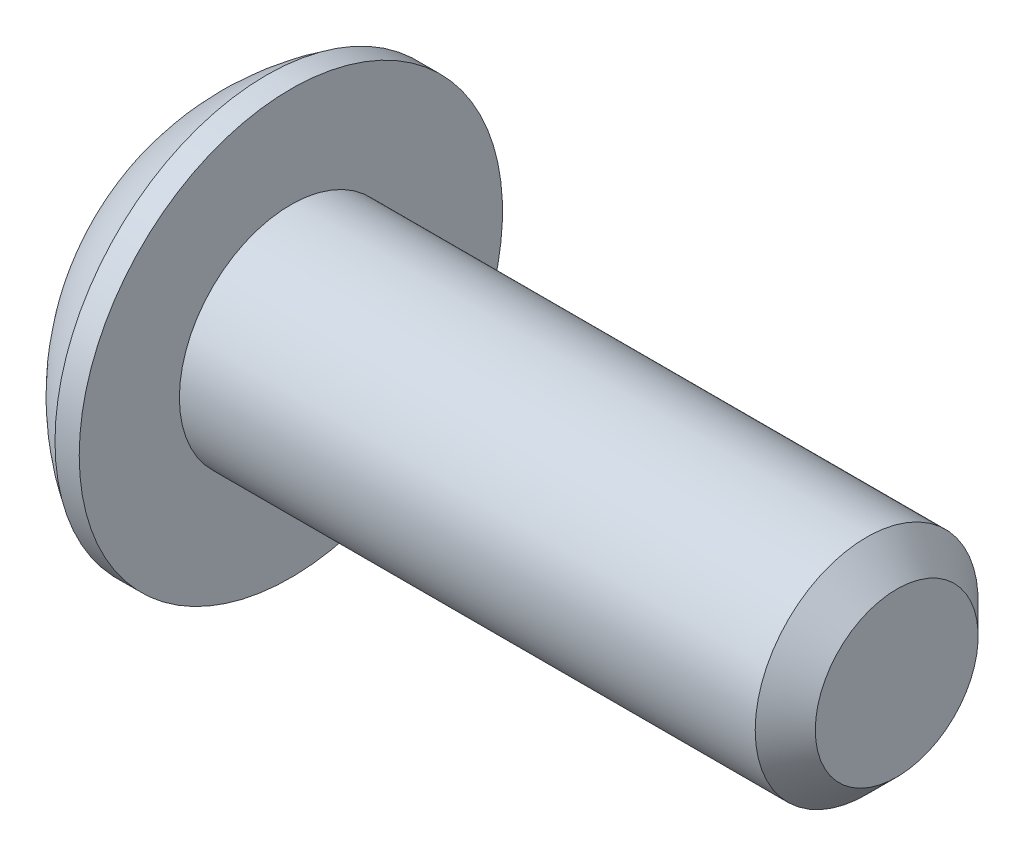
ISO-10303-21;
HEADER;
FILE_DESCRIPTION(('STEP AP214'),'2;1');
FILE_NAME('part.step','',(''),(''),'','','');
FILE_SCHEMA(('AUTOMOTIVE_DESIGN { 1 0 10303 214 1 1 1 1 }'));
ENDSEC;
DATA;
#1=APPLICATION_CONTEXT('core data for automotive mechanical design processes');
#2=APPLICATION_PROTOCOL_DEFINITION('international standard','automotive_design',2000,#1);
#3=PRODUCT_CONTEXT('',#1,'mechanical');
#4=PRODUCT('Part','Part','',(#3));
#5=PRODUCT_RELATED_PRODUCT_CATEGORY('part','',(#4));
#6=PRODUCT_DEFINITION_FORMATION('','',#4);
#7=PRODUCT_DEFINITION_CONTEXT('part definition',#1,'design');
#8=PRODUCT_DEFINITION('design','',#6,#7);
#9=PRODUCT_DEFINITION_SHAPE('','',#8);
#10=(LENGTH_UNIT() NAMED_UNIT(*) SI_UNIT(.MILLI.,.METRE.));
#11=(NAMED_UNIT(*) PLANE_ANGLE_UNIT() SI_UNIT($,.RADIAN.));
#12=(NAMED_UNIT(*) SI_UNIT($,.STERADIAN.) SOLID_ANGLE_UNIT());
#13=UNCERTAINTY_MEASURE_WITH_UNIT(LENGTH_MEASURE(1.E-05),#10,'distance_accuracy_value','');
#14=(GEOMETRIC_REPRESENTATION_CONTEXT(3) GLOBAL_UNCERTAINTY_ASSIGNED_CONTEXT((#13)) GLOBAL_UNIT_ASSIGNED_CONTEXT((#10,
#11,#12)) REPRESENTATION_CONTEXT('',''));
#15=CARTESIAN_POINT('',(0.,0.,0.));
#16=DIRECTION('',(0.,0.,1.));
#17=DIRECTION('',(1.,0.,0.));
#18=AXIS2_PLACEMENT_3D('',#15,#16,#17);
#19=CARTESIAN_POINT('',(0.,0.,0.));
#20=DIRECTION('',(-1.,0.,0.));
#21=DIRECTION('',(0.,0.,1.));
#22=AXIS2_PLACEMENT_3D('',#19,#20,#21);
#23=PLANE('',#22);
#24=CARTESIAN_POINT('',(0.,0.,0.));
#25=DIRECTION('',(-1.,0.,0.));
#26=DIRECTION('',(0.,0.,1.));
#27=AXIS2_PLACEMENT_3D('',#24,#25,#26);
#28=CIRCLE('',#27,1.6637);
#29=CARTESIAN_POINT('',(0.,1.6637,0.));
#30=VERTEX_POINT('',#29);
#31=EDGE_CURVE('E11',#30,#30,#28,.T.);
#32=ORIENTED_EDGE('',*,*,#31,.T.);
#33=EDGE_LOOP('',(#32));
#34=FACE_BOUND('',#33,.T.);
#35=DIRECTION('',(0.,-1.,0.));
#36=VECTOR('',#35,1.);
#37=CARTESIAN_POINT('',(0.,-0.571923176659242,0.9906));
#38=LINE('',#37,#36);
#39=CARTESIAN_POINT('',(0.,0.571923176659245,0.9906));
#40=VERTEX_POINT('',#39);
#41=CARTESIAN_POINT('',(0.,-0.571923176659242,0.9906));
#42=VERTEX_POINT('',#41);
#43=EDGE_CURVE('E47',#40,#42,#38,.T.);
#44=ORIENTED_EDGE('',*,*,#43,.T.);
#45=DIRECTION('',(0.,-0.5,-0.866025403784439));
#46=VECTOR('',#45,1.);
#47=CARTESIAN_POINT('',(0.,-1.14384635331848,0.));
#48=LINE('',#47,#46);
#49=CARTESIAN_POINT('',(0.,-1.14384635331848,0.));
#50=VERTEX_POINT('',#49);
#51=EDGE_CURVE('E368',#42,#50,#48,.T.);
#52=ORIENTED_EDGE('',*,*,#51,.T.);
#53=DIRECTION('',(0.,0.5,-0.866025403784439));
#54=VECTOR('',#53,1.);
#55=CARTESIAN_POINT('',(0.,-0.571923176659242,-0.9906));
#56=LINE('',#55,#54);
#57=CARTESIAN_POINT('',(0.,-0.571923176659242,-0.9906));
#58=VERTEX_POINT('',#57);
#59=EDGE_CURVE('E132',#50,#58,#56,.T.);
#60=ORIENTED_EDGE('',*,*,#59,.T.);
#61=DIRECTION('',(0.,1.,0.));
#62=VECTOR('',#61,1.);
#63=CARTESIAN_POINT('',(0.,0.571923176659245,-0.9906));
#64=LINE('',#63,#62);
#65=CARTESIAN_POINT('',(0.,0.571923176659245,-0.9906));
#66=VERTEX_POINT('',#65);
#67=EDGE_CURVE('E371',#58,#66,#64,.T.);
#68=ORIENTED_EDGE('',*,*,#67,.T.);
#69=DIRECTION('',(0.,0.5,0.866025403784439));
#70=VECTOR('',#69,1.);
#71=CARTESIAN_POINT('',(0.,1.14384635331849,0.));
#72=LINE('',#71,#70);
#73=CARTESIAN_POINT('',(0.,1.14384635331849,0.));
#74=VERTEX_POINT('',#73);
#75=EDGE_CURVE('E373',#66,#74,#72,.T.);
#76=ORIENTED_EDGE('',*,*,#75,.T.);
#77=DIRECTION('',(0.,-0.5,0.866025403784439));
#78=VECTOR('',#77,1.);
#79=CARTESIAN_POINT('',(0.,0.571923176659245,0.9906));
#80=LINE('',#79,#78);
#81=EDGE_CURVE('E375',#74,#40,#80,.T.);
#82=ORIENTED_EDGE('',*,*,#81,.T.);
#83=EDGE_LOOP('',(#44,#52,#60,#68,#76,#82));
#84=FACE_BOUND('',#83,.T.);
#85=ADVANCED_FACE('F33',(#34,#84),#23,.T.);
#86=CARTESIAN_POINT('',(3.55485043103448,0.,0.));
#87=DIRECTION('',(-1.,0.,0.));
#88=DIRECTION('',(0.,1.,0.));
#89=AXIS2_PLACEMENT_3D('',#86,#87,#88);
#90=SPHERICAL_SURFACE('',#89,3.92490245445999);
#91=CARTESIAN_POINT('',(1.4732,0.,0.));
#92=DIRECTION('',(-1.,0.,0.));
#93=DIRECTION('',(0.,0.,1.));
#94=AXIS2_PLACEMENT_3D('',#91,#92,#93);
#95=CIRCLE('',#94,3.3274);
#96=CARTESIAN_POINT('',(1.4732,3.3274,0.));
#97=VERTEX_POINT('',#96);
#98=EDGE_CURVE('E40',#97,#97,#95,.T.);
#99=CARTESIAN_POINT('',(1.4732,3.3274,0.));
#100=CARTESIAN_POINT('',(1.45330383338302,3.31495281350127,0.));
#101=CARTESIAN_POINT('',(1.43351933465701,3.30232713364523,0.));
#102=CARTESIAN_POINT('',(1.39417998096444,3.27672293945236,0.));
#103=CARTESIAN_POINT('',(1.37462512599787,3.26374442511553,0.));
#104=CARTESIAN_POINT('',(1.33575136780167,3.23743871419496,0.));
#105=CARTESIAN_POINT('',(1.31643246457203,3.22411151761122,0.));
#106=CARTESIAN_POINT('',(1.27803682210257,3.19711273705128,0.));
#107=CARTESIAN_POINT('',(1.25896008286274,3.18344115307508,0.));
#108=CARTESIAN_POINT('',(1.22105490800766,3.15575799525025,0.));
#109=CARTESIAN_POINT('',(1.20222647239241,3.14174642140161,0.));
#110=CARTESIAN_POINT('',(1.1648239631005,3.11338779293801,0.));
#111=CARTESIAN_POINT('',(1.14624988942385,3.09904073832305,0.));
#112=CARTESIAN_POINT('',(1.1093620808555,3.07001576479871,0.));
#113=CARTESIAN_POINT('',(1.09104834596381,3.05533784588932,0.));
#114=CARTESIAN_POINT('',(1.05468710793785,3.02565586687034,0.));
#115=CARTESIAN_POINT('',(1.03663960480358,3.01065180676075,0.));
#116=CARTESIAN_POINT('',(1.00081663762422,2.98032237333929,0.));
#117=CARTESIAN_POINT('',(0.983041173579128,2.96499700002743,0.));
#118=CARTESIAN_POINT('',(0.947768004365813,2.93402987160278,0.));
#119=CARTESIAN_POINT('',(0.930270299197587,2.91838811648999,0.));
#120=CARTESIAN_POINT('',(0.895558278150386,2.8867932576672,0.));
#121=CARTESIAN_POINT('',(0.878343962271412,2.87084015395718,0.));
#122=CARTESIAN_POINT('',(0.844204259025566,2.83862773133017,0.));
#123=CARTESIAN_POINT('',(0.827278871658694,2.82236841241317,0.));
#124=CARTESIAN_POINT('',(0.79372247168862,2.78954879129617,0.));
#125=CARTESIAN_POINT('',(0.777091459085418,2.77298848909617,0.));
#126=CARTESIAN_POINT('',(0.744129160170297,2.73957223018758,0.));
#127=CARTESIAN_POINT('',(0.727797873858377,2.722716273479,0.));
#128=CARTESIAN_POINT('',(0.695440282607511,2.68871412946341,0.));
#129=CARTESIAN_POINT('',(0.679413977668563,2.6715679421564,0.));
#130=CARTESIAN_POINT('',(0.647671506108413,2.63699085424448,0.));
#131=CARTESIAN_POINT('',(0.63195533948721,2.61955995363958,0.));
#132=CARTESIAN_POINT('',(0.600838201711008,2.58441904804749,0.));
#133=CARTESIAN_POINT('',(0.58543723055601,2.5667090430603,0.));
#134=CARTESIAN_POINT('',(0.554955439437071,2.53101562742945,0.));
#135=CARTESIAN_POINT('',(0.53987461947313,2.51303221678579,0.));
#136=CARTESIAN_POINT('',(0.510037983442905,2.47679777654429,0.));
#137=CARTESIAN_POINT('',(0.495282167376621,2.45854674694645,0.));
#138=CARTESIAN_POINT('',(0.466100287268539,2.42178294161331,0.));
#139=CARTESIAN_POINT('',(0.451674223226741,2.40327016587801,0.));
#140=CARTESIAN_POINT('',(0.423156489186868,2.36598882531137,0.));
#141=CARTESIAN_POINT('',(0.409064819188792,2.34722026048002,0.));
#142=CARTESIAN_POINT('',(0.381220407654211,2.30943338107051,0.));
#143=CARTESIAN_POINT('',(0.367467666117706,2.29041506649236,0.));
#144=CARTESIAN_POINT('',(0.340305536863938,2.25213480730286,0.));
#145=CARTESIAN_POINT('',(0.326896149146676,2.23287286269151,0.));
#146=CARTESIAN_POINT('',(0.300425042403801,2.19411154154494,0.));
#147=CARTESIAN_POINT('',(0.287363323378188,2.17461216500972,0.));
#148=CARTESIAN_POINT('',(0.261591757021412,2.135382254524,0.));
#149=CARTESIAN_POINT('',(0.248881909690248,2.11565172057349,0.));
#150=CARTESIAN_POINT('',(0.223818176487825,2.07596584415351,0.));
#151=CARTESIAN_POINT('',(0.211464290616564,2.05601050168404,0.));
#152=CARTESIAN_POINT('',(0.187116455603135,2.01588142943932,0.));
#153=CARTESIAN_POINT('',(0.175122506460965,1.99570769966405,0.));
#154=CARTESIAN_POINT('',(0.15149840418644,1.9551483443759,0.));
#155=CARTESIAN_POINT('',(0.139868251054083,1.93476271886302,0.));
#156=CARTESIAN_POINT('',(0.116975483644661,1.89378613154432,0.));
#157=CARTESIAN_POINT('',(0.105712869367595,1.87319516973851,0.));
#158=CARTESIAN_POINT('',(0.0835588019074144,1.83181453649859,0.));
#159=CARTESIAN_POINT('',(0.0726673487243005,1.81102486506448,0.));
#160=CARTESIAN_POINT('',(0.0512591149920269,1.76925349889341,0.));
#161=CARTESIAN_POINT('',(0.0407423344428671,1.74827180415644,0.));
#162=CARTESIAN_POINT('',(0.0200868043622349,1.7061231554675,0.));
#163=CARTESIAN_POINT('',(0.00994805483076251,1.68495620151554,0.));
#164=CARTESIAN_POINT('',(0.,1.6637,0.));
#165=B_SPLINE_CURVE_WITH_KNOTS('',3,(#99,#100,#101,#102,#103,#104,#105,#106,#107,#108,#109,#110,
#111,#112,#113,#114,#115,#116,#117,#118,#119,#120,#121,#122,#123,#124,#125,#126,#127,#128,#129,
#130,#131,#132,#133,#134,#135,#136,#137,#138,#139,#140,#141,#142,#143,#144,#145,#146,#147,#148,
#149,#150,#151,#152,#153,#154,#155,#156,#157,#158,#159,#160,#161,#162,#163,#164),.UNSPECIFIED.,
.F.,.F.,(4,2,2,2,2,2,2,2,2,2,2,2,2,2,2,2,2,2,2,2,2,2,2,2,2,2,2,2,2,2,2,2,4),(0.,
0.0704057950343177,0.140811590068636,0.211217385102953,0.281623180137271,0.352028975171589,
0.422434770205906,0.492840565240224,0.563246360274542,0.63365215530886,0.704057950343178,
0.774463745377495,0.844869540411813,0.915275335446131,0.985681130480448,1.05608692551477,
1.12649272054908,1.1968985155834,1.26730431061772,1.33771010565204,1.40811590068636,
1.47852169572067,1.54892749075499,1.61933328578931,1.68973908082363,1.76014487585794,
1.83055067089226,1.90095646592658,1.9713622609609,2.04176805599521,2.11217385102953,
2.18257964606385,2.25298544109817),.UNSPECIFIED.);
#166=EDGE_CURVE('BSEAM159',#97,#30,#165,.T.);
#167=ORIENTED_EDGE('',*,*,#98,.T.);
#168=ORIENTED_EDGE('',*,*,#31,.F.);
#169=ORIENTED_EDGE('',*,*,#166,.T.);
#170=ORIENTED_EDGE('',*,*,#166,.F.);
#171=EDGE_LOOP('',(#167,#169,#168,#170));
#172=FACE_BOUND('',#171,.T.);
#173=ADVANCED_FACE('F159',(#172),#90,.T.);
#174=CARTESIAN_POINT('',(0.,0.,0.));
#175=DIRECTION('',(-1.,0.,0.));
#176=DIRECTION('',(0.,0.,1.));
#177=AXIS2_PLACEMENT_3D('',#174,#175,#176);
#178=CYLINDRICAL_SURFACE('',#177,3.3274);
#179=ORIENTED_EDGE('',*,*,#98,.F.);
#180=EDGE_LOOP('',(#179));
#181=FACE_BOUND('',#180,.T.);
#182=CARTESIAN_POINT('',(1.8542,0.,0.));
#183=DIRECTION('',(-1.,0.,0.));
#184=DIRECTION('',(0.,0.,1.));
#185=AXIS2_PLACEMENT_3D('',#182,#183,#184);
#186=CIRCLE('',#185,3.3274);
#187=CARTESIAN_POINT('',(1.8542,0.,3.3274));
#188=VERTEX_POINT('',#187);
#189=EDGE_CURVE('E154',#188,#188,#186,.T.);
#190=ORIENTED_EDGE('',*,*,#189,.T.);
#191=EDGE_LOOP('',(#190));
#192=FACE_BOUND('',#191,.T.);
#193=ADVANCED_FACE('F162',(#181,#192),#178,.T.);
#194=CARTESIAN_POINT('',(1.8542,1.7526,0.));
#195=DIRECTION('',(-1.,0.,0.));
#196=DIRECTION('',(0.,0.,1.));
#197=AXIS2_PLACEMENT_3D('',#194,#195,#196);
#198=PLANE('',#197);
#199=ORIENTED_EDGE('',*,*,#189,.F.);
#200=EDGE_LOOP('',(#199));
#201=FACE_BOUND('',#200,.T.);
#202=CARTESIAN_POINT('',(1.8542,0.,0.));
#203=DIRECTION('',(-1.,0.,0.));
#204=DIRECTION('',(0.,0.,1.));
#205=AXIS2_PLACEMENT_3D('',#202,#203,#204);
#206=CIRCLE('',#205,1.7526);
#207=CARTESIAN_POINT('',(1.8542,0.,1.7526));
#208=VERTEX_POINT('',#207);
#209=EDGE_CURVE('E151',#208,#208,#206,.T.);
#210=ORIENTED_EDGE('',*,*,#209,.T.);
#211=EDGE_LOOP('',(#210));
#212=FACE_BOUND('',#211,.T.);
#213=ADVANCED_FACE('F165',(#201,#212),#198,.F.);
#214=CARTESIAN_POINT('',(0.,0.,0.));
#215=DIRECTION('',(-1.,0.,0.));
#216=DIRECTION('',(0.,0.,1.));
#217=AXIS2_PLACEMENT_3D('',#214,#215,#216);
#218=CYLINDRICAL_SURFACE('',#217,1.7526);
#219=ORIENTED_EDGE('',*,*,#209,.F.);
#220=EDGE_LOOP('',(#219));
#221=FACE_BOUND('',#220,.T.);
#222=CARTESIAN_POINT('',(10.90676,0.,0.));
#223=DIRECTION('',(-1.,0.,0.));
#224=DIRECTION('',(0.,0.,1.));
#225=AXIS2_PLACEMENT_3D('',#222,#223,#224);
#226=CIRCLE('',#225,1.7526);
#227=CARTESIAN_POINT('',(10.90676,0.,1.7526));
#228=VERTEX_POINT('',#227);
#229=EDGE_CURVE('E148',#228,#228,#226,.T.);
#230=ORIENTED_EDGE('',*,*,#229,.T.);
#231=EDGE_LOOP('',(#230));
#232=FACE_BOUND('',#231,.T.);
#233=ADVANCED_FACE('F171',(#221,#232),#218,.T.);
#234=CARTESIAN_POINT('',(11.3792,0.,0.));
#235=DIRECTION('',(-1.,0.,0.));
#236=DIRECTION('',(0.,0.,1.));
#237=AXIS2_PLACEMENT_3D('',#234,#235,#236);
#238=CONICAL_SURFACE('',#237,1.28016,0.785398163397446);
#239=ORIENTED_EDGE('',*,*,#229,.F.);
#240=EDGE_LOOP('',(#239));
#241=FACE_BOUND('',#240,.T.);
#242=CARTESIAN_POINT('',(11.3792,0.,0.));
#243=DIRECTION('',(-1.,0.,0.));
#244=DIRECTION('',(0.,0.,1.));
#245=AXIS2_PLACEMENT_3D('',#242,#243,#244);
#246=CIRCLE('',#245,1.28016);
#247=CARTESIAN_POINT('',(11.3792,0.,1.28016));
#248=VERTEX_POINT('',#247);
#249=EDGE_CURVE('E144',#248,#248,#246,.T.);
#250=ORIENTED_EDGE('',*,*,#249,.T.);
#251=EDGE_LOOP('',(#250));
#252=FACE_BOUND('',#251,.T.);
#253=ADVANCED_FACE('F177',(#241,#252),#238,.T.);
#254=CARTESIAN_POINT('',(11.3792,0.,0.));
#255=DIRECTION('',(-1.,0.,0.));
#256=DIRECTION('',(0.,0.,1.));
#257=AXIS2_PLACEMENT_3D('',#254,#255,#256);
#258=PLANE('',#257);
#259=ORIENTED_EDGE('',*,*,#249,.F.);
#260=EDGE_LOOP('',(#259));
#261=FACE_BOUND('',#260,.T.);
#262=ADVANCED_FACE('F183',(#261),#258,.F.);
#263=CARTESIAN_POINT('',(1.1176,-1.14384635331848,0.));
#264=DIRECTION('',(0.,0.866025403784439,-0.5));
#265=DIRECTION('',(0.,0.5,0.866025403784439));
#266=AXIS2_PLACEMENT_3D('',#263,#264,#265);
#267=PLANE('',#266);
#268=DIRECTION('',(0.,-0.5,-0.866025403784439));
#269=VECTOR('',#268,1.);
#270=CARTESIAN_POINT('',(1.1176,-1.14384635331848,0.));
#271=LINE('',#270,#269);
#272=CARTESIAN_POINT('',(1.1176,-0.571923176659242,0.9906));
#273=VERTEX_POINT('',#272);
#274=CARTESIAN_POINT('',(1.1176,-0.857884764988864,0.495299999999999));
#275=VERTEX_POINT('',#274);
#276=EDGE_CURVE('E115',#273,#275,#271,.T.);
#277=ORIENTED_EDGE('',*,*,#276,.T.);
#278=CARTESIAN_POINT('',(1.1176,-1.14384635331848,0.));
#279=VERTEX_POINT('',#278);
#280=EDGE_CURVE('E108',#275,#279,#271,.T.);
#281=ORIENTED_EDGE('',*,*,#280,.T.);
#282=DIRECTION('',(-1.,0.,0.));
#283=VECTOR('',#282,1.);
#284=CARTESIAN_POINT('',(1.1176,-1.14384635331848,0.));
#285=LINE('',#284,#283);
#286=EDGE_CURVE('E112',#279,#50,#285,.T.);
#287=ORIENTED_EDGE('',*,*,#286,.T.);
#288=ORIENTED_EDGE('',*,*,#51,.F.);
#289=DIRECTION('',(-1.,0.,0.));
#290=VECTOR('',#289,1.);
#291=CARTESIAN_POINT('',(1.1176,-0.571923176659242,0.9906));
#292=LINE('',#291,#290);
#293=EDGE_CURVE('E367',#273,#42,#292,.T.);
#294=ORIENTED_EDGE('',*,*,#293,.F.);
#295=EDGE_LOOP('',(#277,#281,#287,#288,#294));
#296=FACE_BOUND('',#295,.T.);
#297=ADVANCED_FACE('F110',(#296),#267,.T.);
#298=CARTESIAN_POINT('',(1.1176,-0.571923176659242,-0.9906));
#299=DIRECTION('',(0.,0.866025403784439,0.5));
#300=DIRECTION('',(0.,-0.5,0.866025403784439));
#301=AXIS2_PLACEMENT_3D('',#298,#299,#300);
#302=PLANE('',#301);
#303=DIRECTION('',(0.,0.5,-0.866025403784439));
#304=VECTOR('',#303,1.);
#305=CARTESIAN_POINT('',(1.1176,-0.571923176659242,-0.9906));
#306=LINE('',#305,#304);
#307=CARTESIAN_POINT('',(1.1176,-0.857884764988864,-0.495299999999999));
#308=VERTEX_POINT('',#307);
#309=EDGE_CURVE('E120',#279,#308,#306,.T.);
#310=ORIENTED_EDGE('',*,*,#309,.T.);
#311=CARTESIAN_POINT('',(1.1176,-0.571923176659242,-0.9906));
#312=VERTEX_POINT('',#311);
#313=EDGE_CURVE('E127',#308,#312,#306,.T.);
#314=ORIENTED_EDGE('',*,*,#313,.T.);
#315=DIRECTION('',(-1.,0.,0.));
#316=VECTOR('',#315,1.);
#317=CARTESIAN_POINT('',(1.1176,-0.571923176659242,-0.9906));
#318=LINE('',#317,#316);
#319=EDGE_CURVE('E134',#312,#58,#318,.T.);
#320=ORIENTED_EDGE('',*,*,#319,.T.);
#321=ORIENTED_EDGE('',*,*,#59,.F.);
#322=ORIENTED_EDGE('',*,*,#286,.F.);
#323=EDGE_LOOP('',(#310,#314,#320,#321,#322));
#324=FACE_BOUND('',#323,.T.);
#325=ADVANCED_FACE('F130',(#324),#302,.T.);
#326=CARTESIAN_POINT('',(1.1176,0.571923176659245,-0.9906));
#327=DIRECTION('',(0.,0.,1.));
#328=DIRECTION('',(1.,0.,0.));
#329=AXIS2_PLACEMENT_3D('',#326,#327,#328);
#330=PLANE('',#329);
#331=DIRECTION('',(0.,1.,0.));
#332=VECTOR('',#331,1.);
#333=CARTESIAN_POINT('',(1.1176,0.571923176659245,-0.9906));
#334=LINE('',#333,#332);
#335=CARTESIAN_POINT('',(1.1176,0.,-0.9906));
#336=VERTEX_POINT('',#335);
#337=EDGE_CURVE('E392',#312,#336,#334,.T.);
#338=ORIENTED_EDGE('',*,*,#337,.T.);
#339=CARTESIAN_POINT('',(1.1176,0.571923176659245,-0.9906));
#340=VERTEX_POINT('',#339);
#341=EDGE_CURVE('E126',#336,#340,#334,.T.);
#342=ORIENTED_EDGE('',*,*,#341,.T.);
#343=DIRECTION('',(-1.,0.,0.));
#344=VECTOR('',#343,1.);
#345=CARTESIAN_POINT('',(1.1176,0.571923176659245,-0.9906));
#346=LINE('',#345,#344);
#347=EDGE_CURVE('E139',#340,#66,#346,.T.);
#348=ORIENTED_EDGE('',*,*,#347,.T.);
#349=ORIENTED_EDGE('',*,*,#67,.F.);
#350=ORIENTED_EDGE('',*,*,#319,.F.);
#351=EDGE_LOOP('',(#338,#342,#348,#349,#350));
#352=FACE_BOUND('',#351,.T.);
#353=ADVANCED_FACE('F242',(#352),#330,.T.);
#354=CARTESIAN_POINT('',(1.1176,1.14384635331849,0.));
#355=DIRECTION('',(0.,-0.866025403784439,0.5));
#356=DIRECTION('',(0.,-0.5,-0.866025403784439));
#357=AXIS2_PLACEMENT_3D('',#354,#355,#356);
#358=PLANE('',#357);
#359=DIRECTION('',(0.,0.5,0.866025403784439));
#360=VECTOR('',#359,1.);
#361=CARTESIAN_POINT('',(1.1176,1.14384635331849,0.));
#362=LINE('',#361,#360);
#363=CARTESIAN_POINT('',(1.1176,0.857884764988866,-0.495300000000001));
#364=VERTEX_POINT('',#363);
#365=EDGE_CURVE('E354',#340,#364,#362,.T.);
#366=ORIENTED_EDGE('',*,*,#365,.T.);
#367=CARTESIAN_POINT('',(1.1176,1.14384635331849,0.));
#368=VERTEX_POINT('',#367);
#369=EDGE_CURVE('E394',#364,#368,#362,.T.);
#370=ORIENTED_EDGE('',*,*,#369,.T.);
#371=DIRECTION('',(-1.,0.,0.));
#372=VECTOR('',#371,1.);
#373=CARTESIAN_POINT('',(1.1176,1.14384635331849,0.));
#374=LINE('',#373,#372);
#375=EDGE_CURVE('E360',#368,#74,#374,.T.);
#376=ORIENTED_EDGE('',*,*,#375,.T.);
#377=ORIENTED_EDGE('',*,*,#75,.F.);
#378=ORIENTED_EDGE('',*,*,#347,.F.);
#379=EDGE_LOOP('',(#366,#370,#376,#377,#378));
#380=FACE_BOUND('',#379,.T.);
#381=ADVANCED_FACE('F251',(#380),#358,.T.);
#382=CARTESIAN_POINT('',(1.1176,0.571923176659245,0.9906));
#383=DIRECTION('',(0.,-0.866025403784439,-0.5));
#384=DIRECTION('',(0.,0.5,-0.866025403784439));
#385=AXIS2_PLACEMENT_3D('',#382,#383,#384);
#386=PLANE('',#385);
#387=DIRECTION('',(0.,-0.5,0.866025403784439));
#388=VECTOR('',#387,1.);
#389=CARTESIAN_POINT('',(1.1176,0.571923176659245,0.9906));
#390=LINE('',#389,#388);
#391=CARTESIAN_POINT('',(1.1176,0.857884764988866,0.495300000000001));
#392=VERTEX_POINT('',#391);
#393=EDGE_CURVE('E353',#368,#392,#390,.T.);
#394=ORIENTED_EDGE('',*,*,#393,.T.);
#395=CARTESIAN_POINT('',(1.1176,0.571923176659245,0.9906));
#396=VERTEX_POINT('',#395);
#397=EDGE_CURVE('E350',#392,#396,#390,.T.);
#398=ORIENTED_EDGE('',*,*,#397,.T.);
#399=DIRECTION('',(-1.,0.,0.));
#400=VECTOR('',#399,1.);
#401=CARTESIAN_POINT('',(1.1176,0.571923176659245,0.9906));
#402=LINE('',#401,#400);
#403=EDGE_CURVE('E380',#396,#40,#402,.T.);
#404=ORIENTED_EDGE('',*,*,#403,.T.);
#405=ORIENTED_EDGE('',*,*,#81,.F.);
#406=ORIENTED_EDGE('',*,*,#375,.F.);
#407=EDGE_LOOP('',(#394,#398,#404,#405,#406));
#408=FACE_BOUND('',#407,.T.);
#409=ADVANCED_FACE('F261',(#408),#386,.T.);
#410=CARTESIAN_POINT('',(1.1176,-0.571923176659242,0.9906));
#411=DIRECTION('',(0.,0.,-1.));
#412=DIRECTION('',(-1.,0.,0.));
#413=AXIS2_PLACEMENT_3D('',#410,#411,#412);
#414=PLANE('',#413);
#415=DIRECTION('',(0.,-1.,0.));
#416=VECTOR('',#415,1.);
#417=CARTESIAN_POINT('',(1.1176,-0.571923176659242,0.9906));
#418=LINE('',#417,#416);
#419=CARTESIAN_POINT('',(1.1176,0.,0.9906));
#420=VERTEX_POINT('',#419);
#421=EDGE_CURVE('E55',#396,#420,#418,.T.);
#422=ORIENTED_EDGE('',*,*,#421,.T.);
#423=EDGE_CURVE('E362',#420,#273,#418,.T.);
#424=ORIENTED_EDGE('',*,*,#423,.T.);
#425=ORIENTED_EDGE('',*,*,#293,.T.);
#426=ORIENTED_EDGE('',*,*,#43,.F.);
#427=ORIENTED_EDGE('',*,*,#403,.F.);
#428=EDGE_LOOP('',(#422,#424,#425,#426,#427));
#429=FACE_BOUND('',#428,.T.);
#430=ADVANCED_FACE('F271',(#429),#414,.T.);
#431=CARTESIAN_POINT('',(1.1176,-0.571923176659242,0.9906));
#432=DIRECTION('',(-1.,0.,0.));
#433=DIRECTION('',(0.,0.,1.));
#434=AXIS2_PLACEMENT_3D('',#431,#432,#433);
#435=PLANE('',#434);
#436=ORIENTED_EDGE('',*,*,#421,.F.);
#437=ORIENTED_EDGE('',*,*,#397,.F.);
#438=CARTESIAN_POINT('',(1.1176,0.,0.));
#439=DIRECTION('',(-1.,0.,0.));
#440=DIRECTION('',(0.,0.,1.));
#441=AXIS2_PLACEMENT_3D('',#438,#439,#440);
#442=CIRCLE('',#441,0.9906);
#443=EDGE_CURVE('E138',#420,#392,#442,.T.);
#444=ORIENTED_EDGE('',*,*,#443,.F.);
#445=EDGE_LOOP('',(#436,#437,#444));
#446=FACE_BOUND('',#445,.T.);
#447=ADVANCED_FACE('F281',(#446),#435,.T.);
#448=ORIENTED_EDGE('',*,*,#393,.F.);
#449=ORIENTED_EDGE('',*,*,#369,.F.);
#450=EDGE_CURVE('E145',#392,#364,#442,.T.);
#451=ORIENTED_EDGE('',*,*,#450,.F.);
#452=EDGE_LOOP('',(#448,#449,#451));
#453=FACE_BOUND('',#452,.T.);
#454=ADVANCED_FACE('F290',(#453),#435,.T.);
#455=ORIENTED_EDGE('',*,*,#365,.F.);
#456=ORIENTED_EDGE('',*,*,#341,.F.);
#457=EDGE_CURVE('E395',#364,#336,#442,.T.);
#458=ORIENTED_EDGE('',*,*,#457,.F.);
#459=EDGE_LOOP('',(#455,#456,#458));
#460=FACE_BOUND('',#459,.T.);
#461=ADVANCED_FACE('F301',(#460),#435,.T.);
#462=ORIENTED_EDGE('',*,*,#337,.F.);
#463=ORIENTED_EDGE('',*,*,#313,.F.);
#464=EDGE_CURVE('E393',#336,#308,#442,.T.);
#465=ORIENTED_EDGE('',*,*,#464,.F.);
#466=EDGE_LOOP('',(#462,#463,#465));
#467=FACE_BOUND('',#466,.T.);
#468=ADVANCED_FACE('F310',(#467),#435,.T.);
#469=ORIENTED_EDGE('',*,*,#309,.F.);
#470=ORIENTED_EDGE('',*,*,#280,.F.);
#471=EDGE_CURVE('E122',#308,#275,#442,.T.);
#472=ORIENTED_EDGE('',*,*,#471,.F.);
#473=EDGE_LOOP('',(#469,#470,#472));
#474=FACE_BOUND('',#473,.T.);
#475=ADVANCED_FACE('F121',(#474),#435,.T.);
#476=ORIENTED_EDGE('',*,*,#276,.F.);
#477=ORIENTED_EDGE('',*,*,#423,.F.);
#478=EDGE_CURVE('E133',#275,#420,#442,.T.);
#479=ORIENTED_EDGE('',*,*,#478,.F.);
#480=EDGE_LOOP('',(#476,#477,#479));
#481=FACE_BOUND('',#480,.T.);
#482=ADVANCED_FACE('F293',(#481),#435,.T.);
#483=CARTESIAN_POINT('',(1.68952317665925,0.,0.));
#484=DIRECTION('',(-1.,0.,0.));
#485=DIRECTION('',(0.,0.,1.));
#486=AXIS2_PLACEMENT_3D('',#483,#484,#485);
#487=CONICAL_SURFACE('',#486,0.,1.04719755119659);
#488=ORIENTED_EDGE('',*,*,#443,.T.);
#489=ORIENTED_EDGE('',*,*,#450,.T.);
#490=ORIENTED_EDGE('',*,*,#457,.T.);
#491=ORIENTED_EDGE('',*,*,#464,.T.);
#492=ORIENTED_EDGE('',*,*,#471,.T.);
#493=ORIENTED_EDGE('',*,*,#478,.T.);
#494=EDGE_LOOP('',(#488,#489,#490,#491,#492,#493));
#495=FACE_BOUND('',#494,.T.);
#496=CARTESIAN_POINT('',(1.68952317665925,0.,0.));
#497=VERTEX_POINT('',#496);
#498=VERTEX_LOOP('',#497);
#499=FACE_BOUND('',#498,.T.);
#500=ADVANCED_FACE('F334',(#495,#499),#487,.F.);
#501=CLOSED_SHELL('',(#85,#173,#193,#213,#233,#253,#262,#297,#325,#353,#381,#409,#430,#447,#454,
#461,#468,#475,#482,#500));
#502=MANIFOLD_SOLID_BREP('B2',#501);
#503=ADVANCED_BREP_SHAPE_REPRESENTATION('',(#18,#502),#14);
#504=SHAPE_DEFINITION_REPRESENTATION(#9,#503);
ENDSEC;
END-ISO-10303-21;
